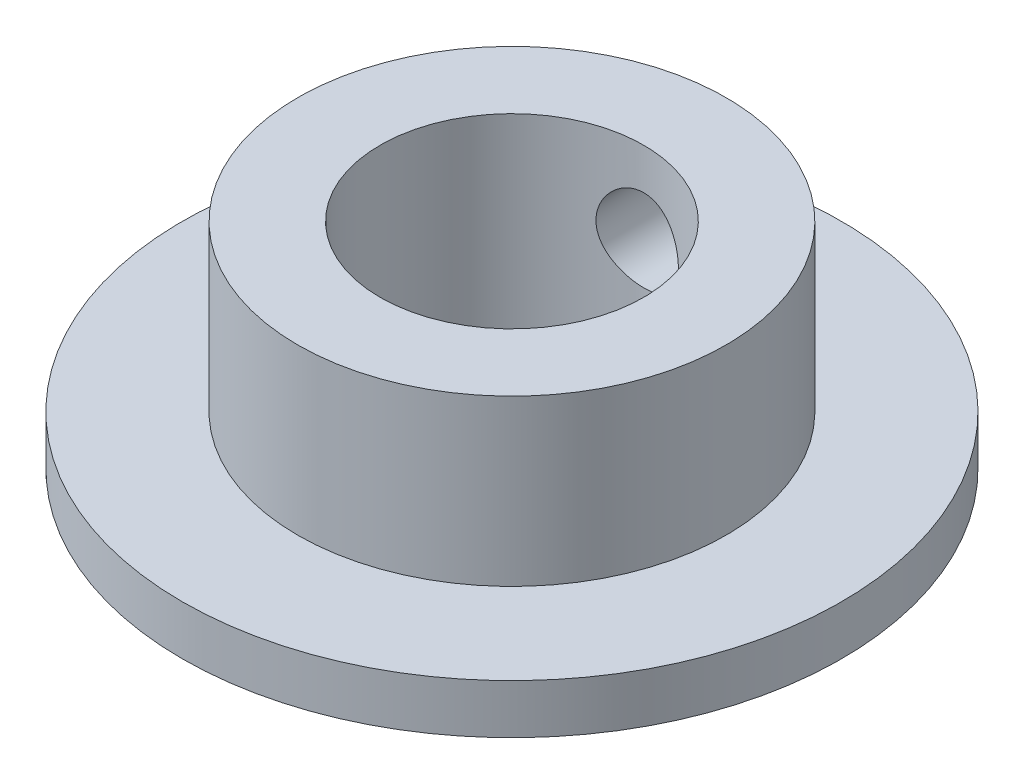
ISO-10303-21;
HEADER;
FILE_DESCRIPTION(('STEP AP214'),'2;1');
FILE_NAME('part.step','',(''),(''),'','','');
FILE_SCHEMA(('AUTOMOTIVE_DESIGN { 1 0 10303 214 1 1 1 1 }'));
ENDSEC;
DATA;
#1=APPLICATION_CONTEXT('core data for automotive mechanical design processes');
#2=APPLICATION_PROTOCOL_DEFINITION('international standard','automotive_design',2000,#1);
#3=PRODUCT_CONTEXT('',#1,'mechanical');
#4=PRODUCT('Part','Part','',(#3));
#5=PRODUCT_RELATED_PRODUCT_CATEGORY('part','',(#4));
#6=PRODUCT_DEFINITION_FORMATION('','',#4);
#7=PRODUCT_DEFINITION_CONTEXT('part definition',#1,'design');
#8=PRODUCT_DEFINITION('design','',#6,#7);
#9=PRODUCT_DEFINITION_SHAPE('','',#8);
#10=(LENGTH_UNIT() NAMED_UNIT(*) SI_UNIT(.MILLI.,.METRE.));
#11=(NAMED_UNIT(*) PLANE_ANGLE_UNIT() SI_UNIT($,.RADIAN.));
#12=(NAMED_UNIT(*) SI_UNIT($,.STERADIAN.) SOLID_ANGLE_UNIT());
#13=UNCERTAINTY_MEASURE_WITH_UNIT(LENGTH_MEASURE(1.E-05),#10,'distance_accuracy_value','');
#14=(GEOMETRIC_REPRESENTATION_CONTEXT(3) GLOBAL_UNCERTAINTY_ASSIGNED_CONTEXT((#13)) GLOBAL_UNIT_ASSIGNED_CONTEXT((#10,
#11,#12)) REPRESENTATION_CONTEXT('',''));
#15=CARTESIAN_POINT('',(0.,0.,0.));
#16=DIRECTION('',(0.,0.,1.));
#17=DIRECTION('',(1.,0.,0.));
#18=AXIS2_PLACEMENT_3D('',#15,#16,#17);
#19=CARTESIAN_POINT('',(0.,3.,0.));
#20=DIRECTION('',(0.,1.,0.));
#21=DIRECTION('',(0.,0.,1.));
#22=AXIS2_PLACEMENT_3D('',#19,#20,#21);
#23=PLANE('',#22);
#24=CARTESIAN_POINT('',(0.,3.,0.));
#25=DIRECTION('',(0.,1.,0.));
#26=DIRECTION('',(0.,0.,1.));
#27=AXIS2_PLACEMENT_3D('',#24,#25,#26);
#28=CIRCLE('',#27,20.);
#29=CARTESIAN_POINT('',(0.,3.,20.));
#30=VERTEX_POINT('',#29);
#31=EDGE_CURVE('E10',#30,#30,#28,.T.);
#32=ORIENTED_EDGE('',*,*,#31,.T.);
#33=EDGE_LOOP('',(#32));
#34=FACE_BOUND('',#33,.T.);
#35=CARTESIAN_POINT('',(0.,3.,0.));
#36=DIRECTION('',(0.,1.,0.));
#37=DIRECTION('',(0.,0.,1.));
#38=AXIS2_PLACEMENT_3D('',#35,#36,#37);
#39=CIRCLE('',#38,13.);
#40=CARTESIAN_POINT('',(0.,3.,13.));
#41=VERTEX_POINT('',#40);
#42=EDGE_CURVE('E63',#41,#41,#39,.T.);
#43=ORIENTED_EDGE('',*,*,#42,.F.);
#44=EDGE_LOOP('',(#43));
#45=FACE_BOUND('',#44,.T.);
#46=ADVANCED_FACE('F37',(#34,#45),#23,.T.);
#47=CARTESIAN_POINT('',(0.,0.,0.));
#48=DIRECTION('',(0.,1.,0.));
#49=DIRECTION('',(0.,0.,1.));
#50=AXIS2_PLACEMENT_3D('',#47,#48,#49);
#51=PLANE('',#50);
#52=CARTESIAN_POINT('',(0.,0.,0.));
#53=DIRECTION('',(0.,1.,0.));
#54=DIRECTION('',(0.,0.,1.));
#55=AXIS2_PLACEMENT_3D('',#52,#53,#54);
#56=CIRCLE('',#55,20.);
#57=CARTESIAN_POINT('',(0.,0.,20.));
#58=VERTEX_POINT('',#57);
#59=EDGE_CURVE('E51',#58,#58,#56,.T.);
#60=ORIENTED_EDGE('',*,*,#59,.F.);
#61=EDGE_LOOP('',(#60));
#62=FACE_BOUND('',#61,.T.);
#63=CARTESIAN_POINT('',(0.,0.,0.));
#64=DIRECTION('',(0.,1.,0.));
#65=DIRECTION('',(0.,0.,1.));
#66=AXIS2_PLACEMENT_3D('',#63,#64,#65);
#67=CIRCLE('',#66,8.);
#68=CARTESIAN_POINT('',(0.,0.,8.));
#69=VERTEX_POINT('',#68);
#70=EDGE_CURVE('E57',#69,#69,#67,.T.);
#71=ORIENTED_EDGE('',*,*,#70,.T.);
#72=EDGE_LOOP('',(#71));
#73=FACE_BOUND('',#72,.T.);
#74=ADVANCED_FACE('F102',(#62,#73),#51,.F.);
#75=CARTESIAN_POINT('',(0.,3.,0.));
#76=DIRECTION('',(0.,-1.,0.));
#77=DIRECTION('',(0.,0.,-1.));
#78=AXIS2_PLACEMENT_3D('',#75,#76,#77);
#79=CYLINDRICAL_SURFACE('',#78,20.);
#80=ORIENTED_EDGE('',*,*,#31,.F.);
#81=EDGE_LOOP('',(#80));
#82=FACE_BOUND('',#81,.T.);
#83=ORIENTED_EDGE('',*,*,#59,.T.);
#84=EDGE_LOOP('',(#83));
#85=FACE_BOUND('',#84,.T.);
#86=ADVANCED_FACE('F39',(#82,#85),#79,.T.);
#87=CARTESIAN_POINT('',(0.,3.,0.));
#88=DIRECTION('',(0.,-1.,0.));
#89=DIRECTION('',(0.,0.,-1.));
#90=AXIS2_PLACEMENT_3D('',#87,#88,#89);
#91=CYLINDRICAL_SURFACE('',#90,8.);
#92=CARTESIAN_POINT('',(0.,10.5,-8.));
#93=CARTESIAN_POINT('',(-0.136878370349093,10.4999991068248,-7.9999993175598));
#94=CARTESIAN_POINT('',(-0.273766105005719,10.4887215461111,-7.99645389969682));
#95=CARTESIAN_POINT('',(-0.543538419176897,10.4440275169215,-7.98265788177613));
#96=CARTESIAN_POINT('',(-0.676422085451815,10.4106060372713,-7.97240576399719));
#97=CARTESIAN_POINT('',(-0.934257087301613,10.3228612576085,-7.94631631395819));
#98=CARTESIAN_POINT('',(-1.05922035397161,10.2685703106941,-7.9304876299805));
#99=CARTESIAN_POINT('',(-1.29826960469292,10.1407653646433,-7.89487938322185));
#100=CARTESIAN_POINT('',(-1.41235387088977,10.0672483364388,-7.8750991979981));
#101=CARTESIAN_POINT('',(-1.62993066990456,9.90068801596528,-7.83300427480564));
#102=CARTESIAN_POINT('',(-1.73304005631332,9.80715822987785,-7.81063431853977));
#103=CARTESIAN_POINT('',(-1.92239476407399,9.6042632151729,-7.76620092748417));
#104=CARTESIAN_POINT('',(-2.00863694579739,9.4948950450109,-7.74413755046914));
#105=CARTESIAN_POINT('',(-2.16388672966227,9.26011087238383,-7.70222289396344));
#106=CARTESIAN_POINT('',(-2.23241568300258,9.13436504494555,-7.68243976603591));
#107=CARTESIAN_POINT('',(-2.34719482153343,8.87241537003625,-7.64815603598468));
#108=CARTESIAN_POINT('',(-2.39345087543889,8.73621428841213,-7.63365404257377));
#109=CARTESIAN_POINT('',(-2.46096919860067,8.46154384509587,-7.61215213969001));
#110=CARTESIAN_POINT('',(-2.48294220015729,8.32326631272229,-7.60493945859016));
#111=CARTESIAN_POINT('',(-2.50349110073976,8.04481376217621,-7.598201102819));
#112=CARTESIAN_POINT('',(-2.50207321991544,7.90463925835667,-7.59867338454668));
#113=CARTESIAN_POINT('',(-2.47643649465479,7.63225107946203,-7.60706378150876));
#114=CARTESIAN_POINT('',(-2.45312115738766,7.49994174827687,-7.61468683491897));
#115=CARTESIAN_POINT('',(-2.38581626711252,7.2412156869253,-7.63604051304978));
#116=CARTESIAN_POINT('',(-2.34182451689101,7.1147995845824,-7.64977178686229));
#117=CARTESIAN_POINT('',(-2.23377749362555,6.86929611113473,-7.68202088028593));
#118=CARTESIAN_POINT('',(-2.16943851324164,6.75034277861603,-7.70060569321649));
#119=CARTESIAN_POINT('',(-2.02272041475696,6.52462446424175,-7.74043713160139));
#120=CARTESIAN_POINT('',(-1.94033661043155,6.41786265949257,-7.76168444789102));
#121=CARTESIAN_POINT('',(-1.75543390836425,6.21445011316602,-7.80563055600986));
#122=CARTESIAN_POINT('',(-1.65216914118564,6.11848088444063,-7.82835139211391));
#123=CARTESIAN_POINT('',(-1.43072881619106,5.94505621284064,-7.8718314151916));
#124=CARTESIAN_POINT('',(-1.31255215469804,5.86760214156158,-7.89259045676745));
#125=CARTESIAN_POINT('',(-1.06332922093091,5.73294462279745,-7.93002589780382));
#126=CARTESIAN_POINT('',(-0.93218981383856,5.67590372907206,-7.94666921296415));
#127=CARTESIAN_POINT('',(-0.661535955565289,5.58489399829686,-7.97375911657108));
#128=CARTESIAN_POINT('',(-0.522024061449217,5.55091815552321,-7.98420758650304));
#129=CARTESIAN_POINT('',(-0.24437031458069,5.50816391484204,-7.99742778790026));
#130=CARTESIAN_POINT('',(-0.106383697577686,5.49846291281295,-8.00048045790873));
#131=CARTESIAN_POINT('',(0.169260611465172,5.50193245327466,-7.99939599461967));
#132=CARTESIAN_POINT('',(0.306918348613018,5.51509965464522,-7.9952599116227));
#133=CARTESIAN_POINT('',(0.574438665951698,5.56319118521277,-7.98044727539523));
#134=CARTESIAN_POINT('',(0.704409956841873,5.59756653522497,-7.96993586221374));
#135=CARTESIAN_POINT('',(0.956703857722754,5.68642870473343,-7.94360242758579));
#136=CARTESIAN_POINT('',(1.07902552089812,5.74091800805002,-7.92777975028687));
#137=CARTESIAN_POINT('',(1.31586481334438,5.86994643309737,-7.89197085518848));
#138=CARTESIAN_POINT('',(1.43011947957558,5.94494197499362,-7.87189253635335));
#139=CARTESIAN_POINT('',(1.64473170192052,6.11230642023484,-7.82986820006859));
#140=CARTESIAN_POINT('',(1.7450854760879,6.20468003548928,-7.80792167695774));
#141=CARTESIAN_POINT('',(1.93317492583804,6.40851778010419,-7.76353989766283));
#142=CARTESIAN_POINT('',(2.02025304679063,6.52059332747844,-7.74111973412882));
#143=CARTESIAN_POINT('',(2.17442500490303,6.75825323275355,-7.69923894191211));
#144=CARTESIAN_POINT('',(2.24151915946859,6.88383737605396,-7.6797782662262));
#145=CARTESIAN_POINT('',(2.35340166961085,7.14469034574095,-7.64623564661738));
#146=CARTESIAN_POINT('',(2.39827639112025,7.27991929887144,-7.63213292713749));
#147=CARTESIAN_POINT('',(2.4644578863618,7.55654498649724,-7.6110234168862));
#148=CARTESIAN_POINT('',(2.48577362827989,7.69793935268706,-7.60401392602455));
#149=CARTESIAN_POINT('',(2.50358812316251,7.97600817516085,-7.59816585427753));
#150=CARTESIAN_POINT('',(2.50116559243271,8.11260690769483,-7.59897209200283));
#151=CARTESIAN_POINT('',(2.47417636257668,8.38334916988387,-7.60780180751807));
#152=CARTESIAN_POINT('',(2.44961069645024,8.51749281377347,-7.61582494863207));
#153=CARTESIAN_POINT('',(2.37975459827235,8.77758807918378,-7.63793628366779));
#154=CARTESIAN_POINT('',(2.33477284812017,8.90363088218672,-7.65193396380513));
#155=CARTESIAN_POINT('',(2.22560454669999,9.146480827068,-7.68439408509128));
#156=CARTESIAN_POINT('',(2.16141408888474,9.2632860841568,-7.70285743429343));
#157=CARTESIAN_POINT('',(2.01271350026987,9.48929194087962,-7.74306974067005));
#158=CARTESIAN_POINT('',(1.92750667048265,9.59801625900047,-7.76491897845913));
#159=CARTESIAN_POINT('',(1.7404179928096,9.79997265622399,-7.8089799764242));
#160=CARTESIAN_POINT('',(1.63853168468878,9.89320057798212,-7.83119183213308));
#161=CARTESIAN_POINT('',(1.41697332564669,10.0645650767259,-7.87434543904947));
#162=CARTESIAN_POINT('',(1.29682914897477,10.1421094728999,-7.89522203461345));
#163=CARTESIAN_POINT('',(1.0445582760273,10.2757978302789,-7.93253538593755));
#164=CARTESIAN_POINT('',(0.912436315590898,10.3319502042837,-7.94897388631644));
#165=CARTESIAN_POINT('',(0.651495270747957,10.4171827352169,-7.97441301466941));
#166=CARTESIAN_POINT('',(0.523340674225092,10.4481497346107,-7.98392481612283));
#167=CARTESIAN_POINT('',(0.263459790880495,10.4895567199354,-7.99671800680967));
#168=CARTESIAN_POINT('',(0.131734232279349,10.500000859608,-8.00000065679286));
#169=CARTESIAN_POINT('',(0.,10.5,-8.));
#170=B_SPLINE_CURVE_WITH_KNOTS('',3,(#92,#93,#94,#95,#96,#97,#98,#99,#100,#101,#102,#103,#104,
#105,#106,#107,#108,#109,#110,#111,#112,#113,#114,#115,#116,#117,#118,#119,#120,#121,#122,#123,
#124,#125,#126,#127,#128,#129,#130,#131,#132,#133,#134,#135,#136,#137,#138,#139,#140,#141,#142,
#143,#144,#145,#146,#147,#148,#149,#150,#151,#152,#153,#154,#155,#156,#157,#158,#159,#160,#161,
#162,#163,#164,#165,#166,#167,#168,#169),.UNSPECIFIED.,.T.,.F.,(4,2,2,2,2,2,2,2,2,2,2,2,2,2,2,2,
2,2,2,2,2,2,2,2,2,2,2,2,2,2,2,2,2,2,2,2,2,2,4),(0.,0.41015089886502,0.820394646698133,
1.23000495840487,1.63967984311678,2.06075644390317,2.48191134862553,2.91347542494988,
3.34492572559054,3.7633830033442,4.18172900590277,4.58353834844338,4.98539039958126,
5.3931128544109,5.80094132020717,6.227334945592,6.65376014826607,7.0835092137954,
7.51312768989108,7.92615137096475,8.33911471298726,8.74181253445744,9.14456010069,
9.55712649476687,9.96980491418519,10.3988355742628,10.8278594196742,11.2552023150671,
11.6823824779468,12.0902440696666,12.4980866352126,12.8999582681244,13.3019116867944,
13.7195902803182,14.1373807476578,14.5688133627192,15.0000761335177,15.3948927332218,
15.7896294154519),.UNSPECIFIED.);
#171=CARTESIAN_POINT('',(0.,10.5,-8.));
#172=VERTEX_POINT('',#171);
#173=EDGE_CURVE('E74',#172,#172,#170,.T.);
#174=ORIENTED_EDGE('',*,*,#173,.F.);
#175=EDGE_LOOP('',(#174));
#176=FACE_BOUND('',#175,.T.);
#177=ORIENTED_EDGE('',*,*,#70,.F.);
#178=EDGE_LOOP('',(#177));
#179=FACE_BOUND('',#178,.T.);
#180=CARTESIAN_POINT('',(0.,13.,0.));
#181=DIRECTION('',(0.,1.,0.));
#182=DIRECTION('',(0.,0.,1.));
#183=AXIS2_PLACEMENT_3D('',#180,#181,#182);
#184=CIRCLE('',#183,8.);
#185=CARTESIAN_POINT('',(0.,13.,8.));
#186=VERTEX_POINT('',#185);
#187=EDGE_CURVE('E67',#186,#186,#184,.T.);
#188=ORIENTED_EDGE('',*,*,#187,.T.);
#189=EDGE_LOOP('',(#188));
#190=FACE_BOUND('',#189,.T.);
#191=ADVANCED_FACE('F81',(#176,#179,#190),#91,.F.);
#192=CARTESIAN_POINT('',(0.,13.,0.));
#193=DIRECTION('',(0.,1.,0.));
#194=DIRECTION('',(0.,0.,1.));
#195=AXIS2_PLACEMENT_3D('',#192,#193,#194);
#196=PLANE('',#195);
#197=CARTESIAN_POINT('',(0.,13.,0.));
#198=DIRECTION('',(0.,1.,0.));
#199=DIRECTION('',(0.,0.,1.));
#200=AXIS2_PLACEMENT_3D('',#197,#198,#199);
#201=CIRCLE('',#200,13.);
#202=CARTESIAN_POINT('',(0.,13.,13.));
#203=VERTEX_POINT('',#202);
#204=EDGE_CURVE('E62',#203,#203,#201,.T.);
#205=ORIENTED_EDGE('',*,*,#204,.T.);
#206=EDGE_LOOP('',(#205));
#207=FACE_BOUND('',#206,.T.);
#208=ORIENTED_EDGE('',*,*,#187,.F.);
#209=EDGE_LOOP('',(#208));
#210=FACE_BOUND('',#209,.T.);
#211=ADVANCED_FACE('F90',(#207,#210),#196,.T.);
#212=CARTESIAN_POINT('',(0.,13.,0.));
#213=DIRECTION('',(0.,-1.,0.));
#214=DIRECTION('',(0.,0.,-1.));
#215=AXIS2_PLACEMENT_3D('',#212,#213,#214);
#216=CYLINDRICAL_SURFACE('',#215,13.);
#217=CARTESIAN_POINT('',(0.,10.5,-13.));
#218=CARTESIAN_POINT('',(-0.139052660180754,10.4999947587803,-12.9999974610984));
#219=CARTESIAN_POINT('',(-0.278172773072155,10.488359412702,-12.9977459806996));
#220=CARTESIAN_POINT('',(-0.55248813309136,10.4421580551378,-12.9889814495606));
#221=CARTESIAN_POINT('',(-0.687680044894598,10.407573119314,-12.9824648818705));
#222=CARTESIAN_POINT('',(-0.950132537462372,10.3165744195119,-12.9658986493339));
#223=CARTESIAN_POINT('',(-1.07740031971374,10.2601808217264,-12.9558522492613));
#224=CARTESIAN_POINT('',(-1.32065723842359,10.1272238720737,-12.9333215487838));
#225=CARTESIAN_POINT('',(-1.43664719548844,10.0506619892138,-12.9208374259537));
#226=CARTESIAN_POINT('',(-1.65552432974222,9.87852083429222,-12.8946323002435));
#227=CARTESIAN_POINT('',(-1.75824929536754,9.7827371685489,-12.8808989548617));
#228=CARTESIAN_POINT('',(-1.94627668615617,9.57531096280533,-12.8538341361733));
#229=CARTESIAN_POINT('',(-2.03157781945352,9.46366724792342,-12.8405026927277));
#230=CARTESIAN_POINT('',(-2.18301679620621,9.2265360046422,-12.8156309401952));
#231=CARTESIAN_POINT('',(-2.24898851450226,9.10094056889966,-12.8041065326509));
#232=CARTESIAN_POINT('',(-2.35883220315187,8.84019008997343,-12.7843281256073));
#233=CARTESIAN_POINT('',(-2.40270618335278,8.70503591745757,-12.7760738286974));
#234=CARTESIAN_POINT('',(-2.46658610457138,8.43074380828081,-12.7638947012764));
#235=CARTESIAN_POINT('',(-2.48687558791542,8.29167423330292,-12.7599184822057));
#236=CARTESIAN_POINT('',(-2.50389090184761,8.01205236308001,-12.7565908775945));
#237=CARTESIAN_POINT('',(-2.50061895687192,7.87150020905642,-12.7572390554642));
#238=CARTESIAN_POINT('',(-2.47083395608553,7.59496477683792,-12.763040258418));
#239=CARTESIAN_POINT('',(-2.44464430650053,7.45894515523523,-12.7681305946622));
#240=CARTESIAN_POINT('',(-2.37027708135778,7.19326701688441,-12.7821440039021));
#241=CARTESIAN_POINT('',(-2.32209852760331,7.06360878341274,-12.7910672474073));
#242=CARTESIAN_POINT('',(-2.20480765459312,6.81339305618049,-12.8118060352358));
#243=CARTESIAN_POINT('',(-2.13556565597228,6.69289788949199,-12.8236394070727));
#244=CARTESIAN_POINT('',(-1.97820505089347,6.46511502886143,-12.848853471063));
#245=CARTESIAN_POINT('',(-1.89008443268647,6.35782874440831,-12.8622343280499));
#246=CARTESIAN_POINT('',(-1.69572891132668,6.15764146577918,-12.889308238097));
#247=CARTESIAN_POINT('',(-1.58921761155993,6.0650088099632,-12.9030027865394));
#248=CARTESIAN_POINT('',(-1.36202665615399,5.89888449269947,-12.9289572102898));
#249=CARTESIAN_POINT('',(-1.24134684412448,5.82539304255885,-12.9412170697587));
#250=CARTESIAN_POINT('',(-0.988957762488794,5.69959395296034,-12.9629474861032));
#251=CARTESIAN_POINT('',(-0.857233713043068,5.64731526538283,-12.9724142260635));
#252=CARTESIAN_POINT('',(-0.586650569197115,5.56570257665309,-12.9874624721642));
#253=CARTESIAN_POINT('',(-0.447792274642338,5.53636600933479,-12.993044412827));
#254=CARTESIAN_POINT('',(-0.169189915144616,5.50184623384643,-12.9996341283048));
#255=CARTESIAN_POINT('',(-0.0294929779953185,5.49629552815895,-13.0007114935454));
#256=CARTESIAN_POINT('',(0.248832636592824,5.50851777719664,-12.9983632998844));
#257=CARTESIAN_POINT('',(0.387461368986751,5.52628952390234,-12.994937974206));
#258=CARTESIAN_POINT('',(0.658542242580223,5.58434674399503,-12.9840126871957));
#259=CARTESIAN_POINT('',(0.791035903724994,5.62444527842575,-12.976546573136));
#260=CARTESIAN_POINT('',(1.0474195560019,5.72581478012443,-12.9583735448858));
#261=CARTESIAN_POINT('',(1.1713089389197,5.78708724229727,-12.9476664018813));
#262=CARTESIAN_POINT('',(1.40852868267246,5.92987174317474,-12.924025465347));
#263=CARTESIAN_POINT('',(1.52172218526331,6.01160709153679,-12.9110676225358));
#264=CARTESIAN_POINT('',(1.73291860543103,6.19269622349735,-12.8844225517876));
#265=CARTESIAN_POINT('',(1.83092002380893,6.29205174383397,-12.8707352520445));
#266=CARTESIAN_POINT('',(2.01035510164863,6.50722816139603,-12.8439416383922));
#267=CARTESIAN_POINT('',(2.09153739238512,6.62326025028297,-12.8308461515727));
#268=CARTESIAN_POINT('',(2.23325948833317,6.86753032427334,-12.8069410375943));
#269=CARTESIAN_POINT('',(2.29380008432373,6.99576784154856,-12.7961313228739));
#270=CARTESIAN_POINT('',(2.39216884187718,7.26018635894623,-12.7781075731774));
#271=CARTESIAN_POINT('',(2.43010977595278,7.39632413346753,-12.770875715852));
#272=CARTESIAN_POINT('',(2.48254790543446,7.67319507320649,-12.7607868732141));
#273=CARTESIAN_POINT('',(2.49704789991888,7.8139276877074,-12.7579293655635));
#274=CARTESIAN_POINT('',(2.50209511687348,8.09347335592155,-12.7569402050647));
#275=CARTESIAN_POINT('',(2.49303910212207,8.23227912296741,-12.7587302704385));
#276=CARTESIAN_POINT('',(2.45210266538041,8.5063499445064,-12.7666604796616));
#277=CARTESIAN_POINT('',(2.42022239691185,8.64161502280875,-12.7728005942514));
#278=CARTESIAN_POINT('',(2.33471347717499,8.90453661984201,-12.7887053259627));
#279=CARTESIAN_POINT('',(2.28112994200388,9.03220829591764,-12.7984624206699));
#280=CARTESIAN_POINT('',(2.15377970785528,9.27681236189093,-12.8205066533974));
#281=CARTESIAN_POINT('',(2.08001148134918,9.39374393810892,-12.8327939828824));
#282=CARTESIAN_POINT('',(1.91301563814429,9.61553157468463,-12.8587559030273));
#283=CARTESIAN_POINT('',(1.81950009853845,9.72016868148215,-12.8724492796511));
#284=CARTESIAN_POINT('',(1.61626238485009,9.91239737549429,-12.8995420316146));
#285=CARTESIAN_POINT('',(1.50653649326075,9.99998504206809,-12.9129413387038));
#286=CARTESIAN_POINT('',(1.27273625734663,10.1564130168556,-12.9380865705891));
#287=CARTESIAN_POINT('',(1.14853493486942,10.2250663700691,-12.9498154901243));
#288=CARTESIAN_POINT('',(0.890172259350414,10.3404207923641,-12.9701319076699));
#289=CARTESIAN_POINT('',(0.756020253294857,10.3871421678689,-12.9787223099363));
#290=CARTESIAN_POINT('',(0.517923565705545,10.4479845842146,-12.9900734375022));
#291=CARTESIAN_POINT('',(0.415357439701675,10.4674564897523,-12.9937745900334));
#292=CARTESIAN_POINT('',(0.208540158514684,10.493465983637,-12.9987387895389));
#293=CARTESIAN_POINT('',(0.104289050170327,10.500003930898,-13.0000019041681));
#294=CARTESIAN_POINT('',(0.,10.5,-13.));
#295=B_SPLINE_CURVE_WITH_KNOTS('',3,(#217,#218,#219,#220,#221,#222,#223,#224,#225,#226,#227,
#228,#229,#230,#231,#232,#233,#234,#235,#236,#237,#238,#239,#240,#241,#242,#243,#244,#245,#246,
#247,#248,#249,#250,#251,#252,#253,#254,#255,#256,#257,#258,#259,#260,#261,#262,#263,#264,#265,
#266,#267,#268,#269,#270,#271,#272,#273,#274,#275,#276,#277,#278,#279,#280,#281,#282,#283,#284,
#285,#286,#287,#288,#289,#290,#291,#292,#293,#294),.UNSPECIFIED.,.T.,.F.,(4,2,2,2,2,2,2,2,2,2,2,
2,2,2,2,2,2,2,2,2,2,2,2,2,2,2,2,2,2,2,2,2,2,2,2,2,2,2,4),(0.,0.416776540572571,
0.833897184796517,1.25063304157329,1.66733855274582,2.08873532404099,2.51016332788524,
2.93511361824241,3.36002525127149,3.77977378984828,4.19948270045458,4.61336264699441,
5.02726100716069,5.44376099870307,5.86030539553681,6.28376393575653,6.70722715049957,
7.13126639340044,7.5552581990633,7.9726750569953,8.3900702950831,8.80402218494166,
9.21800330627654,9.63671570954055,10.0554694062924,10.480090247665,10.9046948200739,
11.3271624654498,11.7495796603136,12.1649281712355,12.5802738884444,12.9947605928499,
13.4092786732858,13.8303190431965,14.2514561202698,14.6766136027338,15.1013766593073,
15.4139664054683,15.7265474772226),.UNSPECIFIED.);
#296=CARTESIAN_POINT('',(0.,10.5,-13.));
#297=VERTEX_POINT('',#296);
#298=EDGE_CURVE('E41',#297,#297,#295,.T.);
#299=ORIENTED_EDGE('',*,*,#298,.T.);
#300=EDGE_LOOP('',(#299));
#301=FACE_BOUND('',#300,.T.);
#302=ORIENTED_EDGE('',*,*,#204,.F.);
#303=EDGE_LOOP('',(#302));
#304=FACE_BOUND('',#303,.T.);
#305=ORIENTED_EDGE('',*,*,#42,.T.);
#306=EDGE_LOOP('',(#305));
#307=FACE_BOUND('',#306,.T.);
#308=ADVANCED_FACE('F88',(#301,#304,#307),#216,.T.);
#309=CARTESIAN_POINT('',(0.,8.,-20.));
#310=DIRECTION('',(0.,0.,1.));
#311=DIRECTION('',(1.,0.,0.));
#312=AXIS2_PLACEMENT_3D('',#309,#310,#311);
#313=CYLINDRICAL_SURFACE('',#312,2.5);
#314=ORIENTED_EDGE('',*,*,#173,.T.);
#315=EDGE_LOOP('',(#314));
#316=FACE_BOUND('',#315,.T.);
#317=ORIENTED_EDGE('',*,*,#298,.F.);
#318=EDGE_LOOP('',(#317));
#319=FACE_BOUND('',#318,.T.);
#320=ADVANCED_FACE('F84',(#316,#319),#313,.F.);
#321=CLOSED_SHELL('',(#46,#74,#86,#191,#211,#308,#320));
#322=MANIFOLD_SOLID_BREP('B2',#321);
#323=ADVANCED_BREP_SHAPE_REPRESENTATION('',(#18,#322),#14);
#324=SHAPE_DEFINITION_REPRESENTATION(#9,#323);
ENDSEC;
END-ISO-10303-21;
